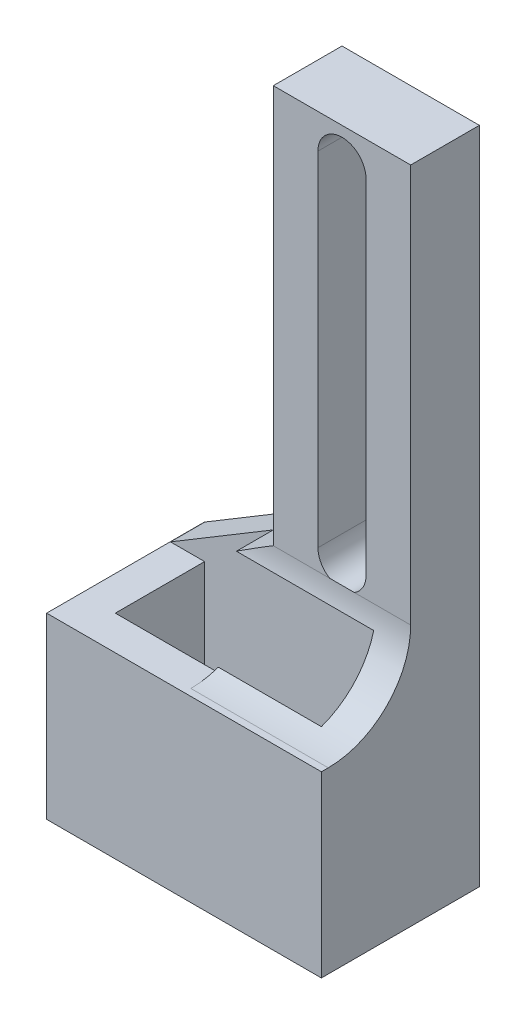
ISO-10303-21;
HEADER;
FILE_DESCRIPTION(('STEP AP214'),'2;1');
FILE_NAME('part.step','',(''),(''),'','','');
FILE_SCHEMA(('AUTOMOTIVE_DESIGN { 1 0 10303 214 1 1 1 1 }'));
ENDSEC;
DATA;
#1=APPLICATION_CONTEXT('core data for automotive mechanical design processes');
#2=APPLICATION_PROTOCOL_DEFINITION('international standard','automotive_design',2000,#1);
#3=PRODUCT_CONTEXT('',#1,'mechanical');
#4=PRODUCT('Part','Part','',(#3));
#5=PRODUCT_RELATED_PRODUCT_CATEGORY('part','',(#4));
#6=PRODUCT_DEFINITION_FORMATION('','',#4);
#7=PRODUCT_DEFINITION_CONTEXT('part definition',#1,'design');
#8=PRODUCT_DEFINITION('design','',#6,#7);
#9=PRODUCT_DEFINITION_SHAPE('','',#8);
#10=(LENGTH_UNIT() NAMED_UNIT(*) SI_UNIT(.MILLI.,.METRE.));
#11=(NAMED_UNIT(*) PLANE_ANGLE_UNIT() SI_UNIT($,.RADIAN.));
#12=(NAMED_UNIT(*) SI_UNIT($,.STERADIAN.) SOLID_ANGLE_UNIT());
#13=UNCERTAINTY_MEASURE_WITH_UNIT(LENGTH_MEASURE(1.E-05),#10,'distance_accuracy_value','');
#14=(GEOMETRIC_REPRESENTATION_CONTEXT(3) GLOBAL_UNCERTAINTY_ASSIGNED_CONTEXT((#13)) GLOBAL_UNIT_ASSIGNED_CONTEXT((#10,
#11,#12)) REPRESENTATION_CONTEXT('',''));
#15=CARTESIAN_POINT('',(0.,0.,0.));
#16=DIRECTION('',(0.,0.,1.));
#17=DIRECTION('',(1.,0.,0.));
#18=AXIS2_PLACEMENT_3D('',#15,#16,#17);
#19=CARTESIAN_POINT('',(0.,0.,5.));
#20=DIRECTION('',(1.,0.,0.));
#21=DIRECTION('',(0.,0.,-1.));
#22=AXIS2_PLACEMENT_3D('',#19,#20,#21);
#23=PLANE('',#22);
#24=CARTESIAN_POINT('',(0.,6.,11.));
#25=DIRECTION('',(1.,0.,0.));
#26=DIRECTION('',(0.,0.,-1.));
#27=AXIS2_PLACEMENT_3D('',#24,#25,#26);
#28=CIRCLE('',#27,6.);
#29=CARTESIAN_POINT('',(0.,0.,11.));
#30=VERTEX_POINT('',#29);
#31=CARTESIAN_POINT('',(0.,0.343145750507619,9.));
#32=VERTEX_POINT('',#31);
#33=EDGE_CURVE('E305',#30,#32,#28,.T.);
#34=ORIENTED_EDGE('',*,*,#33,.T.);
#35=DIRECTION('',(0.,-1.,0.));
#36=VECTOR('',#35,1.);
#37=CARTESIAN_POINT('',(0.,0.,9.));
#38=LINE('',#37,#36);
#39=CARTESIAN_POINT('',(0.,0.,9.));
#40=VERTEX_POINT('',#39);
#41=EDGE_CURVE('E229',#32,#40,#38,.T.);
#42=ORIENTED_EDGE('',*,*,#41,.T.);
#43=DIRECTION('',(0.,0.,-1.));
#44=VECTOR('',#43,1.);
#45=CARTESIAN_POINT('',(0.,0.,5.));
#46=LINE('',#45,#44);
#47=EDGE_CURVE('E274',#30,#40,#46,.T.);
#48=ORIENTED_EDGE('',*,*,#47,.F.);
#49=EDGE_LOOP('',(#34,#42,#48));
#50=FACE_BOUND('',#49,.T.);
#51=ADVANCED_FACE('F33',(#50),#23,.F.);
#52=CARTESIAN_POINT('',(10.,0.,5.));
#53=DIRECTION('',(-1.,0.,0.));
#54=DIRECTION('',(0.,0.,1.));
#55=AXIS2_PLACEMENT_3D('',#52,#53,#54);
#56=PLANE('',#55);
#57=DIRECTION('',(0.,1.,0.));
#58=VECTOR('',#57,1.);
#59=CARTESIAN_POINT('',(10.,0.,0.));
#60=LINE('',#59,#58);
#61=CARTESIAN_POINT('',(10.,-13.,0.));
#62=VERTEX_POINT('',#61);
#63=CARTESIAN_POINT('',(10.,35.,0.));
#64=VERTEX_POINT('',#63);
#65=EDGE_CURVE('E275',#62,#64,#60,.T.);
#66=ORIENTED_EDGE('',*,*,#65,.T.);
#67=DIRECTION('',(0.,0.,-1.));
#68=VECTOR('',#67,1.);
#69=CARTESIAN_POINT('',(10.,35.,5.));
#70=LINE('',#69,#68);
#71=CARTESIAN_POINT('',(10.,35.,5.));
#72=VERTEX_POINT('',#71);
#73=EDGE_CURVE('E287',#72,#64,#70,.T.);
#74=ORIENTED_EDGE('',*,*,#73,.F.);
#75=DIRECTION('',(0.,1.,0.));
#76=VECTOR('',#75,1.);
#77=CARTESIAN_POINT('',(10.,0.,5.));
#78=LINE('',#77,#76);
#79=CARTESIAN_POINT('',(10.,6.,5.));
#80=VERTEX_POINT('',#79);
#81=EDGE_CURVE('E271',#80,#72,#78,.T.);
#82=ORIENTED_EDGE('',*,*,#81,.F.);
#83=CARTESIAN_POINT('',(10.,6.,11.));
#84=DIRECTION('',(-1.,0.,0.));
#85=DIRECTION('',(0.,0.,1.));
#86=AXIS2_PLACEMENT_3D('',#83,#84,#85);
#87=CIRCLE('',#86,6.);
#88=CARTESIAN_POINT('',(10.,0.,11.));
#89=VERTEX_POINT('',#88);
#90=EDGE_CURVE('E303',#80,#89,#87,.T.);
#91=ORIENTED_EDGE('',*,*,#90,.T.);
#92=DIRECTION('',(0.,0.,1.));
#93=VECTOR('',#92,1.);
#94=CARTESIAN_POINT('',(10.,0.,0.));
#95=LINE('',#94,#93);
#96=CARTESIAN_POINT('',(10.,0.,11.5));
#97=VERTEX_POINT('',#96);
#98=EDGE_CURVE('E265',#89,#97,#95,.T.);
#99=ORIENTED_EDGE('',*,*,#98,.T.);
#100=DIRECTION('',(0.,1.,0.));
#101=VECTOR('',#100,1.);
#102=CARTESIAN_POINT('',(10.,-13.,11.5));
#103=LINE('',#102,#101);
#104=CARTESIAN_POINT('',(10.,-13.,11.5));
#105=VERTEX_POINT('',#104);
#106=EDGE_CURVE('E405',#105,#97,#103,.T.);
#107=ORIENTED_EDGE('',*,*,#106,.F.);
#108=DIRECTION('',(0.,0.,1.));
#109=VECTOR('',#108,1.);
#110=CARTESIAN_POINT('',(10.,-13.,0.));
#111=LINE('',#110,#109);
#112=EDGE_CURVE('E249',#62,#105,#111,.T.);
#113=ORIENTED_EDGE('',*,*,#112,.F.);
#114=EDGE_LOOP('',(#66,#74,#82,#91,#99,#107,#113));
#115=FACE_BOUND('',#114,.T.);
#116=ADVANCED_FACE('F391',(#115),#56,.F.);
#117=CARTESIAN_POINT('',(0.,35.,5.));
#118=DIRECTION('',(0.,-1.,0.));
#119=DIRECTION('',(0.,0.,-1.));
#120=AXIS2_PLACEMENT_3D('',#117,#118,#119);
#121=PLANE('',#120);
#122=DIRECTION('',(-1.,0.,0.));
#123=VECTOR('',#122,1.);
#124=CARTESIAN_POINT('',(0.,35.,0.));
#125=LINE('',#124,#123);
#126=CARTESIAN_POINT('',(0.,35.,0.));
#127=VERTEX_POINT('',#126);
#128=EDGE_CURVE('E277',#64,#127,#125,.T.);
#129=ORIENTED_EDGE('',*,*,#128,.T.);
#130=DIRECTION('',(0.,0.,-1.));
#131=VECTOR('',#130,1.);
#132=CARTESIAN_POINT('',(0.,35.,5.));
#133=LINE('',#132,#131);
#134=CARTESIAN_POINT('',(0.,35.,5.));
#135=VERTEX_POINT('',#134);
#136=EDGE_CURVE('E282',#135,#127,#133,.T.);
#137=ORIENTED_EDGE('',*,*,#136,.F.);
#138=DIRECTION('',(-1.,0.,0.));
#139=VECTOR('',#138,1.);
#140=CARTESIAN_POINT('',(0.,35.,5.));
#141=LINE('',#140,#139);
#142=EDGE_CURVE('E268',#72,#135,#141,.T.);
#143=ORIENTED_EDGE('',*,*,#142,.F.);
#144=ORIENTED_EDGE('',*,*,#73,.T.);
#145=EDGE_LOOP('',(#129,#137,#143,#144));
#146=FACE_BOUND('',#145,.T.);
#147=ADVANCED_FACE('F376',(#146),#121,.F.);
#148=DIRECTION('',(0.,-1.,0.));
#149=VECTOR('',#148,1.);
#150=CARTESIAN_POINT('',(0.,0.,0.));
#151=LINE('',#150,#149);
#152=CARTESIAN_POINT('',(0.,5.99999999999998,0.));
#153=VERTEX_POINT('',#152);
#154=EDGE_CURVE('E279',#127,#153,#151,.T.);
#155=ORIENTED_EDGE('',*,*,#154,.T.);
#156=DIRECTION('',(0.,0.,1.));
#157=VECTOR('',#156,1.);
#158=CARTESIAN_POINT('',(0.,5.99999999999998,5.));
#159=LINE('',#158,#157);
#160=CARTESIAN_POINT('',(0.,6.,5.));
#161=VERTEX_POINT('',#160);
#162=EDGE_CURVE('E327',#153,#161,#159,.T.);
#163=ORIENTED_EDGE('',*,*,#162,.T.);
#164=DIRECTION('',(0.,-1.,0.));
#165=VECTOR('',#164,1.);
#166=CARTESIAN_POINT('',(0.,0.,5.));
#167=LINE('',#166,#165);
#168=EDGE_CURVE('E270',#135,#161,#167,.T.);
#169=ORIENTED_EDGE('',*,*,#168,.F.);
#170=ORIENTED_EDGE('',*,*,#136,.T.);
#171=EDGE_LOOP('',(#155,#163,#169,#170));
#172=FACE_BOUND('',#171,.T.);
#173=ADVANCED_FACE('F367',(#172),#23,.F.);
#174=CARTESIAN_POINT('',(10.,0.,5.));
#175=DIRECTION('',(0.,0.,1.));
#176=DIRECTION('',(1.,0.,0.));
#177=AXIS2_PLACEMENT_3D('',#174,#175,#176);
#178=PLANE('',#177);
#179=CARTESIAN_POINT('',(5.,7.5,5.));
#180=DIRECTION('',(0.,0.,1.));
#181=DIRECTION('',(1.,0.,0.));
#182=AXIS2_PLACEMENT_3D('',#179,#180,#181);
#183=CIRCLE('',#182,1.75);
#184=CARTESIAN_POINT('',(5.901387818866,6.,5.));
#185=VERTEX_POINT('',#184);
#186=CARTESIAN_POINT('',(6.75,7.5,5.));
#187=VERTEX_POINT('',#186);
#188=EDGE_CURVE('E198',#185,#187,#183,.T.);
#189=ORIENTED_EDGE('',*,*,#188,.F.);
#190=DIRECTION('',(1.,0.,0.));
#191=VECTOR('',#190,1.);
#192=CARTESIAN_POINT('',(10.,6.,5.));
#193=LINE('',#192,#191);
#194=EDGE_CURVE('E299',#185,#80,#193,.T.);
#195=ORIENTED_EDGE('',*,*,#194,.T.);
#196=ORIENTED_EDGE('',*,*,#81,.T.);
#197=ORIENTED_EDGE('',*,*,#142,.T.);
#198=ORIENTED_EDGE('',*,*,#168,.T.);
#199=CARTESIAN_POINT('',(4.098612181134,6.,5.));
#200=VERTEX_POINT('',#199);
#201=EDGE_CURVE('E295',#161,#200,#193,.T.);
#202=ORIENTED_EDGE('',*,*,#201,.T.);
#203=CARTESIAN_POINT('',(3.25,7.5,5.));
#204=VERTEX_POINT('',#203);
#205=EDGE_CURVE('E197',#204,#200,#183,.T.);
#206=ORIENTED_EDGE('',*,*,#205,.F.);
#207=DIRECTION('',(0.,-1.,0.));
#208=VECTOR('',#207,1.);
#209=CARTESIAN_POINT('',(3.25,32.5,5.));
#210=LINE('',#209,#208);
#211=CARTESIAN_POINT('',(3.25,32.5,5.));
#212=VERTEX_POINT('',#211);
#213=EDGE_CURVE('E176',#212,#204,#210,.T.);
#214=ORIENTED_EDGE('',*,*,#213,.F.);
#215=CARTESIAN_POINT('',(5.,32.5,5.));
#216=DIRECTION('',(0.,0.,1.));
#217=DIRECTION('',(1.,0.,0.));
#218=AXIS2_PLACEMENT_3D('',#215,#216,#217);
#219=CIRCLE('',#218,1.75);
#220=CARTESIAN_POINT('',(6.75,32.5,5.));
#221=VERTEX_POINT('',#220);
#222=EDGE_CURVE('E186',#221,#212,#219,.T.);
#223=ORIENTED_EDGE('',*,*,#222,.F.);
#224=DIRECTION('',(0.,1.,0.));
#225=VECTOR('',#224,1.);
#226=CARTESIAN_POINT('',(6.75,32.5,5.));
#227=LINE('',#226,#225);
#228=EDGE_CURVE('E183',#187,#221,#227,.T.);
#229=ORIENTED_EDGE('',*,*,#228,.F.);
#230=EDGE_LOOP('',(#189,#195,#196,#197,#198,#202,#206,#214,#223,#229));
#231=FACE_BOUND('',#230,.T.);
#232=ADVANCED_FACE('F195',(#231),#178,.T.);
#233=CARTESIAN_POINT('',(10.,0.,0.));
#234=DIRECTION('',(0.,0.,1.));
#235=DIRECTION('',(1.,0.,0.));
#236=AXIS2_PLACEMENT_3D('',#233,#234,#235);
#237=PLANE('',#236);
#238=DIRECTION('',(0.,1.,0.));
#239=VECTOR('',#238,1.);
#240=CARTESIAN_POINT('',(6.75,0.,0.));
#241=LINE('',#240,#239);
#242=CARTESIAN_POINT('',(6.75,7.5,0.));
#243=VERTEX_POINT('',#242);
#244=CARTESIAN_POINT('',(6.75,32.5,0.));
#245=VERTEX_POINT('',#244);
#246=EDGE_CURVE('E318',#243,#245,#241,.T.);
#247=ORIENTED_EDGE('',*,*,#246,.T.);
#248=CARTESIAN_POINT('',(5.,32.5,0.));
#249=DIRECTION('',(0.,0.,1.));
#250=DIRECTION('',(1.,0.,0.));
#251=AXIS2_PLACEMENT_3D('',#248,#249,#250);
#252=CIRCLE('',#251,1.75);
#253=CARTESIAN_POINT('',(3.25,32.5,0.));
#254=VERTEX_POINT('',#253);
#255=EDGE_CURVE('E321',#245,#254,#252,.T.);
#256=ORIENTED_EDGE('',*,*,#255,.T.);
#257=DIRECTION('',(0.,-1.,0.));
#258=VECTOR('',#257,1.);
#259=CARTESIAN_POINT('',(3.25,0.,0.));
#260=LINE('',#259,#258);
#261=CARTESIAN_POINT('',(3.25,7.5,0.));
#262=VERTEX_POINT('',#261);
#263=EDGE_CURVE('E179',#254,#262,#260,.T.);
#264=ORIENTED_EDGE('',*,*,#263,.T.);
#265=CARTESIAN_POINT('',(5.,7.5,0.));
#266=DIRECTION('',(0.,0.,1.));
#267=DIRECTION('',(1.,0.,0.));
#268=AXIS2_PLACEMENT_3D('',#265,#266,#267);
#269=CIRCLE('',#268,1.75);
#270=EDGE_CURVE('E206',#262,#243,#269,.T.);
#271=ORIENTED_EDGE('',*,*,#270,.T.);
#272=EDGE_LOOP('',(#247,#256,#264,#271));
#273=FACE_BOUND('',#272,.T.);
#274=ORIENTED_EDGE('',*,*,#65,.F.);
#275=DIRECTION('',(1.,0.,0.));
#276=VECTOR('',#275,1.);
#277=CARTESIAN_POINT('',(-10.,-13.,0.));
#278=LINE('',#277,#276);
#279=CARTESIAN_POINT('',(-10.,-13.,0.));
#280=VERTEX_POINT('',#279);
#281=EDGE_CURVE('E245',#280,#62,#278,.T.);
#282=ORIENTED_EDGE('',*,*,#281,.F.);
#283=DIRECTION('',(0.,1.,0.));
#284=VECTOR('',#283,1.);
#285=CARTESIAN_POINT('',(-10.,-13.,0.));
#286=LINE('',#285,#284);
#287=CARTESIAN_POINT('',(-10.,0.,0.));
#288=VERTEX_POINT('',#287);
#289=EDGE_CURVE('E266',#280,#288,#286,.T.);
#290=ORIENTED_EDGE('',*,*,#289,.T.);
#291=DIRECTION('',(1.,0.,0.));
#292=VECTOR('',#291,1.);
#293=CARTESIAN_POINT('',(-10.,0.,0.));
#294=LINE('',#293,#292);
#295=CARTESIAN_POINT('',(-9.98567689410321,0.,0.));
#296=VERTEX_POINT('',#295);
#297=EDGE_CURVE('E256',#288,#296,#294,.T.);
#298=ORIENTED_EDGE('',*,*,#297,.T.);
#299=DIRECTION('',(0.857167300702115,0.515038074910049,0.));
#300=VECTOR('',#299,1.);
#301=CARTESIAN_POINT('',(4.69851503535275,8.8231526526523,0.));
#302=LINE('',#301,#300);
#303=EDGE_CURVE('E329',#296,#153,#302,.T.);
#304=ORIENTED_EDGE('',*,*,#303,.T.);
#305=ORIENTED_EDGE('',*,*,#154,.F.);
#306=ORIENTED_EDGE('',*,*,#128,.F.);
#307=EDGE_LOOP('',(#274,#282,#290,#298,#304,#305,#306));
#308=FACE_BOUND('',#307,.T.);
#309=ADVANCED_FACE('F395',(#273,#308),#237,.F.);
#310=CARTESIAN_POINT('',(-10.,0.,11.5));
#311=DIRECTION('',(0.,1.,0.));
#312=DIRECTION('',(-1.,0.,0.));
#313=AXIS2_PLACEMENT_3D('',#310,#311,#312);
#314=PLANE('',#313);
#315=DIRECTION('',(-1.,0.,0.));
#316=VECTOR('',#315,1.);
#317=CARTESIAN_POINT('',(-10.,0.,2.5));
#318=LINE('',#317,#316);
#319=CARTESIAN_POINT('',(-7.5,0.,2.5));
#320=VERTEX_POINT('',#319);
#321=CARTESIAN_POINT('',(-9.98567689410321,0.,2.5));
#322=VERTEX_POINT('',#321);
#323=EDGE_CURVE('E47',#320,#322,#318,.T.);
#324=ORIENTED_EDGE('',*,*,#323,.T.);
#325=DIRECTION('',(0.,0.,-1.));
#326=VECTOR('',#325,1.);
#327=CARTESIAN_POINT('',(-9.98567689410321,0.,11.5));
#328=LINE('',#327,#326);
#329=EDGE_CURVE('E324',#322,#296,#328,.T.);
#330=ORIENTED_EDGE('',*,*,#329,.T.);
#331=ORIENTED_EDGE('',*,*,#297,.F.);
#332=DIRECTION('',(0.,0.,-1.));
#333=VECTOR('',#332,1.);
#334=CARTESIAN_POINT('',(-10.,0.,0.));
#335=LINE('',#334,#333);
#336=CARTESIAN_POINT('',(-10.,0.,11.5));
#337=VERTEX_POINT('',#336);
#338=EDGE_CURVE('E241',#337,#288,#335,.T.);
#339=ORIENTED_EDGE('',*,*,#338,.F.);
#340=DIRECTION('',(-1.,0.,0.));
#341=VECTOR('',#340,1.);
#342=CARTESIAN_POINT('',(-10.,0.,11.5));
#343=LINE('',#342,#341);
#344=EDGE_CURVE('E246',#97,#337,#343,.T.);
#345=ORIENTED_EDGE('',*,*,#344,.F.);
#346=ORIENTED_EDGE('',*,*,#98,.F.);
#347=DIRECTION('',(1.,0.,0.));
#348=VECTOR('',#347,1.);
#349=CARTESIAN_POINT('',(0.,0.,11.));
#350=LINE('',#349,#348);
#351=EDGE_CURVE('E297',#89,#30,#350,.F.);
#352=ORIENTED_EDGE('',*,*,#351,.T.);
#353=ORIENTED_EDGE('',*,*,#47,.T.);
#354=DIRECTION('',(1.,0.,0.));
#355=VECTOR('',#354,1.);
#356=CARTESIAN_POINT('',(-10.,0.,9.));
#357=LINE('',#356,#355);
#358=CARTESIAN_POINT('',(-7.5,0.,9.));
#359=VERTEX_POINT('',#358);
#360=EDGE_CURVE('E237',#359,#40,#357,.T.);
#361=ORIENTED_EDGE('',*,*,#360,.F.);
#362=DIRECTION('',(0.,0.,1.));
#363=VECTOR('',#362,1.);
#364=CARTESIAN_POINT('',(-7.5,0.,11.5));
#365=LINE('',#364,#363);
#366=EDGE_CURVE('E239',#320,#359,#365,.T.);
#367=ORIENTED_EDGE('',*,*,#366,.F.);
#368=EDGE_LOOP('',(#324,#330,#331,#339,#345,#346,#352,#353,#361,#367));
#369=FACE_BOUND('',#368,.T.);
#370=ADVANCED_FACE('F342',(#369),#314,.T.);
#371=CARTESIAN_POINT('',(-10.,-13.,0.));
#372=DIRECTION('',(1.,0.,0.));
#373=DIRECTION('',(0.,0.,-1.));
#374=AXIS2_PLACEMENT_3D('',#371,#372,#373);
#375=PLANE('',#374);
#376=ORIENTED_EDGE('',*,*,#338,.T.);
#377=ORIENTED_EDGE('',*,*,#289,.F.);
#378=DIRECTION('',(0.,0.,-1.));
#379=VECTOR('',#378,1.);
#380=CARTESIAN_POINT('',(-10.,-13.,0.));
#381=LINE('',#380,#379);
#382=CARTESIAN_POINT('',(-10.,-13.,11.5));
#383=VERTEX_POINT('',#382);
#384=EDGE_CURVE('E242',#383,#280,#381,.T.);
#385=ORIENTED_EDGE('',*,*,#384,.F.);
#386=DIRECTION('',(0.,1.,0.));
#387=VECTOR('',#386,1.);
#388=CARTESIAN_POINT('',(-10.,-13.,11.5));
#389=LINE('',#388,#387);
#390=EDGE_CURVE('E253',#383,#337,#389,.T.);
#391=ORIENTED_EDGE('',*,*,#390,.T.);
#392=EDGE_LOOP('',(#376,#377,#385,#391));
#393=FACE_BOUND('',#392,.T.);
#394=ADVANCED_FACE('F403',(#393),#375,.F.);
#395=CARTESIAN_POINT('',(-10.,-13.,11.5));
#396=DIRECTION('',(0.,0.,-1.));
#397=DIRECTION('',(-1.,0.,0.));
#398=AXIS2_PLACEMENT_3D('',#395,#396,#397);
#399=PLANE('',#398);
#400=ORIENTED_EDGE('',*,*,#344,.T.);
#401=ORIENTED_EDGE('',*,*,#390,.F.);
#402=DIRECTION('',(-1.,0.,0.));
#403=VECTOR('',#402,1.);
#404=CARTESIAN_POINT('',(-10.,-13.,11.5));
#405=LINE('',#404,#403);
#406=EDGE_CURVE('E251',#105,#383,#405,.T.);
#407=ORIENTED_EDGE('',*,*,#406,.F.);
#408=ORIENTED_EDGE('',*,*,#106,.T.);
#409=EDGE_LOOP('',(#400,#401,#407,#408));
#410=FACE_BOUND('',#409,.T.);
#411=ADVANCED_FACE('F410',(#410),#399,.F.);
#412=CARTESIAN_POINT('',(-10.,-13.,11.5));
#413=DIRECTION('',(0.,1.,0.));
#414=DIRECTION('',(-1.,0.,0.));
#415=AXIS2_PLACEMENT_3D('',#412,#413,#414);
#416=PLANE('',#415);
#417=DIRECTION('',(1.,0.,0.));
#418=VECTOR('',#417,1.);
#419=CARTESIAN_POINT('',(-7.5,-13.,2.5));
#420=LINE('',#419,#418);
#421=CARTESIAN_POINT('',(-7.5,-13.,2.5));
#422=VERTEX_POINT('',#421);
#423=CARTESIAN_POINT('',(7.5,-13.,2.5));
#424=VERTEX_POINT('',#423);
#425=EDGE_CURVE('E219',#422,#424,#420,.T.);
#426=ORIENTED_EDGE('',*,*,#425,.F.);
#427=DIRECTION('',(0.,0.,-1.));
#428=VECTOR('',#427,1.);
#429=CARTESIAN_POINT('',(-7.5,-13.,2.5));
#430=LINE('',#429,#428);
#431=CARTESIAN_POINT('',(-7.5,-13.,9.));
#432=VERTEX_POINT('',#431);
#433=EDGE_CURVE('E212',#432,#422,#430,.T.);
#434=ORIENTED_EDGE('',*,*,#433,.F.);
#435=DIRECTION('',(-1.,0.,0.));
#436=VECTOR('',#435,1.);
#437=CARTESIAN_POINT('',(-7.5,-13.,9.));
#438=LINE('',#437,#436);
#439=CARTESIAN_POINT('',(7.5,-13.,9.));
#440=VERTEX_POINT('',#439);
#441=EDGE_CURVE('E215',#440,#432,#438,.T.);
#442=ORIENTED_EDGE('',*,*,#441,.F.);
#443=DIRECTION('',(0.,0.,1.));
#444=VECTOR('',#443,1.);
#445=CARTESIAN_POINT('',(7.5,-13.,2.5));
#446=LINE('',#445,#444);
#447=EDGE_CURVE('E222',#424,#440,#446,.T.);
#448=ORIENTED_EDGE('',*,*,#447,.F.);
#449=EDGE_LOOP('',(#426,#434,#442,#448));
#450=FACE_BOUND('',#449,.T.);
#451=ORIENTED_EDGE('',*,*,#384,.T.);
#452=ORIENTED_EDGE('',*,*,#281,.T.);
#453=ORIENTED_EDGE('',*,*,#112,.T.);
#454=ORIENTED_EDGE('',*,*,#406,.T.);
#455=EDGE_LOOP('',(#451,#452,#453,#454));
#456=FACE_BOUND('',#455,.T.);
#457=ADVANCED_FACE('F352',(#450,#456),#416,.F.);
#458=CARTESIAN_POINT('',(10.,6.,11.));
#459=DIRECTION('',(-1.,0.,0.));
#460=DIRECTION('',(0.,-1.,0.));
#461=AXIS2_PLACEMENT_3D('',#458,#459,#460);
#462=CYLINDRICAL_SURFACE('',#461,6.);
#463=CARTESIAN_POINT('',(7.5,6.,11.));
#464=DIRECTION('',(1.,0.,0.));
#465=DIRECTION('',(0.,0.,-1.));
#466=AXIS2_PLACEMENT_3D('',#463,#464,#465);
#467=CIRCLE('',#466,6.);
#468=CARTESIAN_POINT('',(7.5,4.5,5.19052498068887));
#469=VERTEX_POINT('',#468);
#470=CARTESIAN_POINT('',(7.5,0.343145750507619,9.));
#471=VERTEX_POINT('',#470);
#472=EDGE_CURVE('E311',#469,#471,#467,.F.);
#473=ORIENTED_EDGE('',*,*,#472,.T.);
#474=DIRECTION('',(-1.,0.,0.));
#475=VECTOR('',#474,1.);
#476=CARTESIAN_POINT('',(10.,0.343145750507619,9.));
#477=LINE('',#476,#475);
#478=EDGE_CURVE('E314',#471,#32,#477,.T.);
#479=ORIENTED_EDGE('',*,*,#478,.T.);
#480=ORIENTED_EDGE('',*,*,#33,.F.);
#481=ORIENTED_EDGE('',*,*,#351,.F.);
#482=ORIENTED_EDGE('',*,*,#90,.F.);
#483=ORIENTED_EDGE('',*,*,#194,.F.);
#484=EDGE_CURVE('E298',#200,#185,#193,.T.);
#485=ORIENTED_EDGE('',*,*,#484,.F.);
#486=ORIENTED_EDGE('',*,*,#201,.F.);
#487=CARTESIAN_POINT('',(0.,6.,11.));
#488=DIRECTION('',(0.515038074910049,-0.857167300702115,0.));
#489=DIRECTION('',(-0.857167300702115,-0.515038074910049,0.));
#490=AXIS2_PLACEMENT_3D('',#487,#488,#489);
#491=ELLIPSE('',#490,11.6496241584623,6.);
#492=CARTESIAN_POINT('',(-2.49641922352578,4.5,5.19052498068887));
#493=VERTEX_POINT('',#492);
#494=EDGE_CURVE('E331',#161,#493,#491,.F.);
#495=ORIENTED_EDGE('',*,*,#494,.T.);
#496=DIRECTION('',(-1.,0.,0.));
#497=VECTOR('',#496,1.);
#498=CARTESIAN_POINT('',(10.,4.5,5.19052498068887));
#499=LINE('',#498,#497);
#500=EDGE_CURVE('E308',#493,#469,#499,.F.);
#501=ORIENTED_EDGE('',*,*,#500,.T.);
#502=EDGE_LOOP('',(#473,#479,#480,#481,#482,#483,#485,#486,#495,#501));
#503=FACE_BOUND('',#502,.T.);
#504=ADVANCED_FACE('F361',(#503),#462,.F.);
#505=CARTESIAN_POINT('',(-7.5,4.5,2.5));
#506=DIRECTION('',(0.,0.,-1.));
#507=DIRECTION('',(0.,1.,0.));
#508=AXIS2_PLACEMENT_3D('',#505,#506,#507);
#509=PLANE('',#508);
#510=DIRECTION('',(1.,0.,0.));
#511=VECTOR('',#510,1.);
#512=CARTESIAN_POINT('',(-7.5,4.5,2.5));
#513=LINE('',#512,#511);
#514=CARTESIAN_POINT('',(-2.49641922352578,4.5,2.5));
#515=VERTEX_POINT('',#514);
#516=CARTESIAN_POINT('',(7.5,4.5,2.5));
#517=VERTEX_POINT('',#516);
#518=EDGE_CURVE('E53',#515,#517,#513,.T.);
#519=ORIENTED_EDGE('',*,*,#518,.F.);
#520=DIRECTION('',(-0.857167300702115,-0.515038074910049,0.));
#521=VECTOR('',#520,1.);
#522=CARTESIAN_POINT('',(-6.17272905509131,2.29105019886846,2.5));
#523=LINE('',#522,#521);
#524=EDGE_CURVE('E11',#515,#322,#523,.T.);
#525=ORIENTED_EDGE('',*,*,#524,.T.);
#526=ORIENTED_EDGE('',*,*,#323,.F.);
#527=DIRECTION('',(0.,-1.,0.));
#528=VECTOR('',#527,1.);
#529=CARTESIAN_POINT('',(-7.5,4.5,2.5));
#530=LINE('',#529,#528);
#531=EDGE_CURVE('E217',#320,#422,#530,.T.);
#532=ORIENTED_EDGE('',*,*,#531,.T.);
#533=ORIENTED_EDGE('',*,*,#425,.T.);
#534=DIRECTION('',(0.,-1.,0.));
#535=VECTOR('',#534,1.);
#536=CARTESIAN_POINT('',(7.5,4.5,2.5));
#537=LINE('',#536,#535);
#538=EDGE_CURVE('E232',#517,#424,#537,.T.);
#539=ORIENTED_EDGE('',*,*,#538,.F.);
#540=EDGE_LOOP('',(#519,#525,#526,#532,#533,#539));
#541=FACE_BOUND('',#540,.T.);
#542=ADVANCED_FACE('F340',(#541),#509,.F.);
#543=CARTESIAN_POINT('',(7.5,4.5,2.5));
#544=DIRECTION('',(1.,0.,0.));
#545=DIRECTION('',(0.,0.,-1.));
#546=AXIS2_PLACEMENT_3D('',#543,#544,#545);
#547=PLANE('',#546);
#548=DIRECTION('',(0.,0.,1.));
#549=VECTOR('',#548,1.);
#550=CARTESIAN_POINT('',(7.5,4.5,2.5));
#551=LINE('',#550,#549);
#552=EDGE_CURVE('E214',#517,#469,#551,.T.);
#553=ORIENTED_EDGE('',*,*,#552,.F.);
#554=ORIENTED_EDGE('',*,*,#538,.T.);
#555=ORIENTED_EDGE('',*,*,#447,.T.);
#556=DIRECTION('',(0.,-1.,0.));
#557=VECTOR('',#556,1.);
#558=CARTESIAN_POINT('',(7.5,4.5,9.));
#559=LINE('',#558,#557);
#560=EDGE_CURVE('E230',#471,#440,#559,.T.);
#561=ORIENTED_EDGE('',*,*,#560,.F.);
#562=ORIENTED_EDGE('',*,*,#472,.F.);
#563=EDGE_LOOP('',(#553,#554,#555,#561,#562));
#564=FACE_BOUND('',#563,.T.);
#565=ADVANCED_FACE('F358',(#564),#547,.F.);
#566=CARTESIAN_POINT('',(-7.5,4.5,9.));
#567=DIRECTION('',(0.,1.,0.));
#568=DIRECTION('',(0.,0.,1.));
#569=AXIS2_PLACEMENT_3D('',#566,#567,#568);
#570=PLANE('',#569);
#571=ORIENTED_EDGE('',*,*,#518,.T.);
#572=ORIENTED_EDGE('',*,*,#552,.T.);
#573=ORIENTED_EDGE('',*,*,#500,.F.);
#574=DIRECTION('',(0.,0.,-1.));
#575=VECTOR('',#574,1.);
#576=CARTESIAN_POINT('',(-2.49641922352578,4.5,9.));
#577=LINE('',#576,#575);
#578=EDGE_CURVE('E41',#493,#515,#577,.T.);
#579=ORIENTED_EDGE('',*,*,#578,.T.);
#580=EDGE_LOOP('',(#571,#572,#573,#579));
#581=FACE_BOUND('',#580,.T.);
#582=ADVANCED_FACE('F336',(#581),#570,.F.);
#583=CARTESIAN_POINT('',(-7.5,4.5,2.5));
#584=DIRECTION('',(-1.,0.,0.));
#585=DIRECTION('',(0.,0.,1.));
#586=AXIS2_PLACEMENT_3D('',#583,#584,#585);
#587=PLANE('',#586);
#588=ORIENTED_EDGE('',*,*,#366,.T.);
#589=DIRECTION('',(0.,-1.,0.));
#590=VECTOR('',#589,1.);
#591=CARTESIAN_POINT('',(-7.5,4.5,9.));
#592=LINE('',#591,#590);
#593=EDGE_CURVE('E227',#359,#432,#592,.T.);
#594=ORIENTED_EDGE('',*,*,#593,.T.);
#595=ORIENTED_EDGE('',*,*,#433,.T.);
#596=ORIENTED_EDGE('',*,*,#531,.F.);
#597=EDGE_LOOP('',(#588,#594,#595,#596));
#598=FACE_BOUND('',#597,.T.);
#599=ADVANCED_FACE('F347',(#598),#587,.F.);
#600=CARTESIAN_POINT('',(-7.5,4.5,9.));
#601=DIRECTION('',(0.,0.,1.));
#602=DIRECTION('',(1.,0.,0.));
#603=AXIS2_PLACEMENT_3D('',#600,#601,#602);
#604=PLANE('',#603);
#605=ORIENTED_EDGE('',*,*,#360,.T.);
#606=ORIENTED_EDGE('',*,*,#41,.F.);
#607=ORIENTED_EDGE('',*,*,#478,.F.);
#608=ORIENTED_EDGE('',*,*,#560,.T.);
#609=ORIENTED_EDGE('',*,*,#441,.T.);
#610=ORIENTED_EDGE('',*,*,#593,.F.);
#611=EDGE_LOOP('',(#605,#606,#607,#608,#609,#610));
#612=FACE_BOUND('',#611,.T.);
#613=ADVANCED_FACE('F413',(#612),#604,.F.);
#614=CARTESIAN_POINT('',(5.,32.5,-5.));
#615=DIRECTION('',(0.,0.,1.));
#616=DIRECTION('',(1.,0.,0.));
#617=AXIS2_PLACEMENT_3D('',#614,#615,#616);
#618=CYLINDRICAL_SURFACE('',#617,1.75);
#619=DIRECTION('',(0.,0.,1.));
#620=VECTOR('',#619,1.);
#621=CARTESIAN_POINT('',(6.75,32.5,-5.));
#622=LINE('',#621,#620);
#623=EDGE_CURVE('E189',#245,#221,#622,.T.);
#624=ORIENTED_EDGE('',*,*,#623,.T.);
#625=ORIENTED_EDGE('',*,*,#222,.T.);
#626=DIRECTION('',(0.,0.,1.));
#627=VECTOR('',#626,1.);
#628=CARTESIAN_POINT('',(3.25,32.5,-5.));
#629=LINE('',#628,#627);
#630=EDGE_CURVE('E172',#254,#212,#629,.T.);
#631=ORIENTED_EDGE('',*,*,#630,.F.);
#632=ORIENTED_EDGE('',*,*,#255,.F.);
#633=EDGE_LOOP('',(#624,#625,#631,#632));
#634=FACE_BOUND('',#633,.T.);
#635=ADVANCED_FACE('F187',(#634),#618,.F.);
#636=CARTESIAN_POINT('',(6.75,32.5,-5.));
#637=DIRECTION('',(1.,0.,0.));
#638=DIRECTION('',(0.,1.,0.));
#639=AXIS2_PLACEMENT_3D('',#636,#637,#638);
#640=PLANE('',#639);
#641=DIRECTION('',(0.,0.,1.));
#642=VECTOR('',#641,1.);
#643=CARTESIAN_POINT('',(6.75,7.5,-5.));
#644=LINE('',#643,#642);
#645=EDGE_CURVE('E207',#243,#187,#644,.T.);
#646=ORIENTED_EDGE('',*,*,#645,.T.);
#647=ORIENTED_EDGE('',*,*,#228,.T.);
#648=ORIENTED_EDGE('',*,*,#623,.F.);
#649=ORIENTED_EDGE('',*,*,#246,.F.);
#650=EDGE_LOOP('',(#646,#647,#648,#649));
#651=FACE_BOUND('',#650,.T.);
#652=ADVANCED_FACE('F420',(#651),#640,.F.);
#653=CARTESIAN_POINT('',(3.25,32.5,-5.));
#654=DIRECTION('',(-1.,0.,0.));
#655=DIRECTION('',(0.,-1.,0.));
#656=AXIS2_PLACEMENT_3D('',#653,#654,#655);
#657=PLANE('',#656);
#658=ORIENTED_EDGE('',*,*,#630,.T.);
#659=ORIENTED_EDGE('',*,*,#213,.T.);
#660=DIRECTION('',(0.,0.,1.));
#661=VECTOR('',#660,1.);
#662=CARTESIAN_POINT('',(3.25,7.5,-5.));
#663=LINE('',#662,#661);
#664=EDGE_CURVE('E182',#262,#204,#663,.T.);
#665=ORIENTED_EDGE('',*,*,#664,.F.);
#666=ORIENTED_EDGE('',*,*,#263,.F.);
#667=EDGE_LOOP('',(#658,#659,#665,#666));
#668=FACE_BOUND('',#667,.T.);
#669=ADVANCED_FACE('F174',(#668),#657,.F.);
#670=CARTESIAN_POINT('',(5.,7.5,-5.));
#671=DIRECTION('',(0.,0.,1.));
#672=DIRECTION('',(1.,0.,0.));
#673=AXIS2_PLACEMENT_3D('',#670,#671,#672);
#674=CYLINDRICAL_SURFACE('',#673,1.75);
#675=ORIENTED_EDGE('',*,*,#664,.T.);
#676=ORIENTED_EDGE('',*,*,#205,.T.);
#677=EDGE_CURVE('E201',#200,#185,#183,.T.);
#678=ORIENTED_EDGE('',*,*,#677,.T.);
#679=ORIENTED_EDGE('',*,*,#188,.T.);
#680=ORIENTED_EDGE('',*,*,#645,.F.);
#681=ORIENTED_EDGE('',*,*,#270,.F.);
#682=EDGE_LOOP('',(#675,#676,#678,#679,#680,#681));
#683=FACE_BOUND('',#682,.T.);
#684=ADVANCED_FACE('F385',(#683),#674,.F.);
#685=CARTESIAN_POINT('',(5.,32.5,5.));
#686=DIRECTION('',(0.,0.,1.));
#687=DIRECTION('',(1.,0.,0.));
#688=AXIS2_PLACEMENT_3D('',#685,#686,#687);
#689=PLANE('',#688);
#690=ORIENTED_EDGE('',*,*,#484,.T.);
#691=ORIENTED_EDGE('',*,*,#677,.F.);
#692=EDGE_LOOP('',(#690,#691));
#693=FACE_BOUND('',#692,.T.);
#694=ADVANCED_FACE('F383',(#693),#689,.F.);
#695=CARTESIAN_POINT('',(-9.98567689410321,0.,11.5));
#696=DIRECTION('',(0.515038074910049,-0.857167300702115,0.));
#697=DIRECTION('',(0.857167300702115,0.515038074910049,0.));
#698=AXIS2_PLACEMENT_3D('',#695,#696,#697);
#699=PLANE('',#698);
#700=ORIENTED_EDGE('',*,*,#494,.F.);
#701=ORIENTED_EDGE('',*,*,#162,.F.);
#702=ORIENTED_EDGE('',*,*,#303,.F.);
#703=ORIENTED_EDGE('',*,*,#329,.F.);
#704=ORIENTED_EDGE('',*,*,#524,.F.);
#705=ORIENTED_EDGE('',*,*,#578,.F.);
#706=EDGE_LOOP('',(#700,#701,#702,#703,#704,#705));
#707=FACE_BOUND('',#706,.T.);
#708=ADVANCED_FACE('F35',(#707),#699,.F.);
#709=CLOSED_SHELL('',(#51,#116,#147,#173,#232,#309,#370,#394,#411,#457,#504,#542,#565,#582,#599,
#613,#635,#652,#669,#684,#694,#708));
#710=MANIFOLD_SOLID_BREP('B2',#709);
#711=ADVANCED_BREP_SHAPE_REPRESENTATION('',(#18,#710),#14);
#712=SHAPE_DEFINITION_REPRESENTATION(#9,#711);
ENDSEC;
END-ISO-10303-21;
